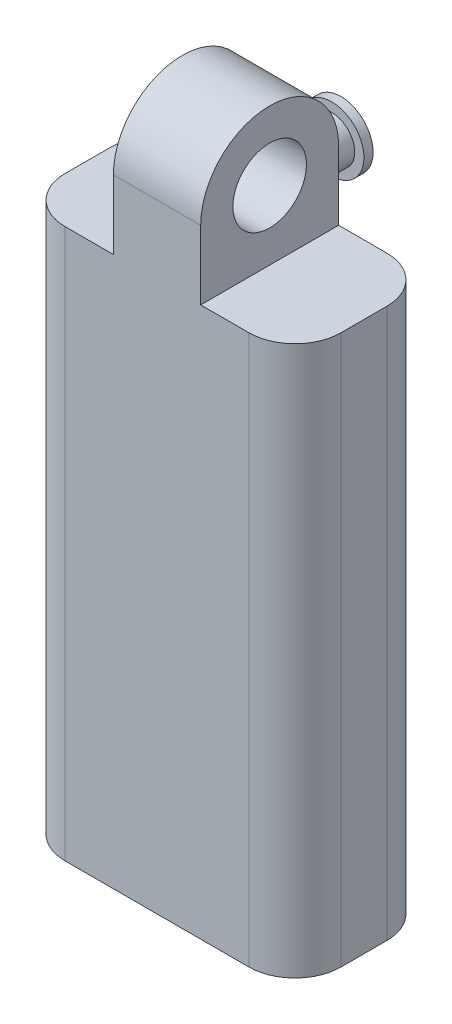
ISO-10303-21;
HEADER;
FILE_DESCRIPTION(('STEP AP214'),'2;1');
FILE_NAME('part.step','',(''),(''),'','','');
FILE_SCHEMA(('AUTOMOTIVE_DESIGN { 1 0 10303 214 1 1 1 1 }'));
ENDSEC;
DATA;
#1=APPLICATION_CONTEXT('core data for automotive mechanical design processes');
#2=APPLICATION_PROTOCOL_DEFINITION('international standard','automotive_design',2000,#1);
#3=PRODUCT_CONTEXT('',#1,'mechanical');
#4=PRODUCT('Part','Part','',(#3));
#5=PRODUCT_RELATED_PRODUCT_CATEGORY('part','',(#4));
#6=PRODUCT_DEFINITION_FORMATION('','',#4);
#7=PRODUCT_DEFINITION_CONTEXT('part definition',#1,'design');
#8=PRODUCT_DEFINITION('design','',#6,#7);
#9=PRODUCT_DEFINITION_SHAPE('','',#8);
#10=(LENGTH_UNIT() NAMED_UNIT(*) SI_UNIT(.MILLI.,.METRE.));
#11=(NAMED_UNIT(*) PLANE_ANGLE_UNIT() SI_UNIT($,.RADIAN.));
#12=(NAMED_UNIT(*) SI_UNIT($,.STERADIAN.) SOLID_ANGLE_UNIT());
#13=UNCERTAINTY_MEASURE_WITH_UNIT(LENGTH_MEASURE(1.E-05),#10,'distance_accuracy_value','');
#14=(GEOMETRIC_REPRESENTATION_CONTEXT(3) GLOBAL_UNCERTAINTY_ASSIGNED_CONTEXT((#13)) GLOBAL_UNIT_ASSIGNED_CONTEXT((#10,
#11,#12)) REPRESENTATION_CONTEXT('',''));
#15=CARTESIAN_POINT('',(0.,0.,0.));
#16=DIRECTION('',(0.,0.,1.));
#17=DIRECTION('',(1.,0.,0.));
#18=AXIS2_PLACEMENT_3D('',#15,#16,#17);
#19=CARTESIAN_POINT('',(2.375,37.37,3.75));
#20=DIRECTION('',(-1.,0.,0.));
#21=DIRECTION('',(0.,0.,1.));
#22=AXIS2_PLACEMENT_3D('',#19,#20,#21);
#23=PLANE('',#22);
#24=CARTESIAN_POINT('',(2.375,33.62,0.));
#25=DIRECTION('',(-1.,0.,0.));
#26=DIRECTION('',(0.,0.,1.));
#27=AXIS2_PLACEMENT_3D('',#24,#25,#26);
#28=CIRCLE('',#27,2.);
#29=CARTESIAN_POINT('',(2.375,33.62,2.));
#30=VERTEX_POINT('',#29);
#31=EDGE_CURVE('E253',#30,#30,#28,.T.);
#32=ORIENTED_EDGE('',*,*,#31,.T.);
#33=EDGE_LOOP('',(#32));
#34=FACE_BOUND('',#33,.T.);
#35=DIRECTION('',(0.,-1.,0.));
#36=VECTOR('',#35,1.);
#37=CARTESIAN_POINT('',(2.375,37.37,-3.75));
#38=LINE('',#37,#36);
#39=CARTESIAN_POINT('',(2.375,33.62,-3.75));
#40=VERTEX_POINT('',#39);
#41=CARTESIAN_POINT('',(2.375,29.87,-3.75));
#42=VERTEX_POINT('',#41);
#43=EDGE_CURVE('E103',#40,#42,#38,.T.);
#44=ORIENTED_EDGE('',*,*,#43,.F.);
#45=CARTESIAN_POINT('',(2.375,33.62,0.));
#46=DIRECTION('',(-1.,0.,0.));
#47=DIRECTION('',(0.,0.,1.));
#48=AXIS2_PLACEMENT_3D('',#45,#46,#47);
#49=CIRCLE('',#48,3.75);
#50=CARTESIAN_POINT('',(2.375,33.62,3.75));
#51=VERTEX_POINT('',#50);
#52=EDGE_CURVE('E172',#51,#40,#49,.T.);
#53=ORIENTED_EDGE('',*,*,#52,.F.);
#54=DIRECTION('',(0.,-1.,0.));
#55=VECTOR('',#54,1.);
#56=CARTESIAN_POINT('',(2.375,37.37,3.75));
#57=LINE('',#56,#55);
#58=CARTESIAN_POINT('',(2.375,29.87,3.75));
#59=VERTEX_POINT('',#58);
#60=EDGE_CURVE('E265',#51,#59,#57,.T.);
#61=ORIENTED_EDGE('',*,*,#60,.T.);
#62=DIRECTION('',(0.,0.,-1.));
#63=VECTOR('',#62,1.);
#64=CARTESIAN_POINT('',(2.375,29.87,3.75));
#65=LINE('',#64,#63);
#66=EDGE_CURVE('E186',#59,#42,#65,.T.);
#67=ORIENTED_EDGE('',*,*,#66,.T.);
#68=EDGE_LOOP('',(#44,#53,#61,#67));
#69=FACE_BOUND('',#68,.T.);
#70=ADVANCED_FACE('F80',(#34,#69),#23,.F.);
#71=CARTESIAN_POINT('',(-2.375,37.37,3.75));
#72=DIRECTION('',(1.,0.,0.));
#73=DIRECTION('',(0.,0.,-1.));
#74=AXIS2_PLACEMENT_3D('',#71,#72,#73);
#75=PLANE('',#74);
#76=CARTESIAN_POINT('',(-2.375,33.62,0.));
#77=DIRECTION('',(1.,0.,0.));
#78=DIRECTION('',(0.,0.,-1.));
#79=AXIS2_PLACEMENT_3D('',#76,#77,#78);
#80=CIRCLE('',#79,2.);
#81=CARTESIAN_POINT('',(-2.375,33.62,-2.00000000000001));
#82=VERTEX_POINT('',#81);
#83=EDGE_CURVE('E178',#82,#82,#80,.T.);
#84=ORIENTED_EDGE('',*,*,#83,.T.);
#85=EDGE_LOOP('',(#84));
#86=FACE_BOUND('',#85,.T.);
#87=CARTESIAN_POINT('',(-2.375,33.62,0.));
#88=DIRECTION('',(1.,0.,0.));
#89=DIRECTION('',(0.,0.,-1.));
#90=AXIS2_PLACEMENT_3D('',#87,#88,#89);
#91=CIRCLE('',#90,3.75);
#92=CARTESIAN_POINT('',(-2.375,33.62,-3.75));
#93=VERTEX_POINT('',#92);
#94=CARTESIAN_POINT('',(-2.375,33.62,3.75));
#95=VERTEX_POINT('',#94);
#96=EDGE_CURVE('E179',#93,#95,#91,.T.);
#97=ORIENTED_EDGE('',*,*,#96,.F.);
#98=DIRECTION('',(0.,-1.,0.));
#99=VECTOR('',#98,1.);
#100=CARTESIAN_POINT('',(-2.375,37.37,-3.75));
#101=LINE('',#100,#99);
#102=CARTESIAN_POINT('',(-2.375,29.87,-3.75));
#103=VERTEX_POINT('',#102);
#104=EDGE_CURVE('E95',#93,#103,#101,.T.);
#105=ORIENTED_EDGE('',*,*,#104,.T.);
#106=DIRECTION('',(0.,0.,1.));
#107=VECTOR('',#106,1.);
#108=CARTESIAN_POINT('',(-2.375,29.87,3.75));
#109=LINE('',#108,#107);
#110=CARTESIAN_POINT('',(-2.375,29.87,3.75));
#111=VERTEX_POINT('',#110);
#112=EDGE_CURVE('E260',#103,#111,#109,.T.);
#113=ORIENTED_EDGE('',*,*,#112,.T.);
#114=DIRECTION('',(0.,-1.,0.));
#115=VECTOR('',#114,1.);
#116=CARTESIAN_POINT('',(-2.375,37.37,3.75));
#117=LINE('',#116,#115);
#118=EDGE_CURVE('E192',#95,#111,#117,.T.);
#119=ORIENTED_EDGE('',*,*,#118,.F.);
#120=EDGE_LOOP('',(#97,#105,#113,#119));
#121=FACE_BOUND('',#120,.T.);
#122=ADVANCED_FACE('F273',(#86,#121),#75,.F.);
#123=CARTESIAN_POINT('',(-4.99999999999998,29.87,-3.75));
#124=DIRECTION('',(0.,0.,1.));
#125=DIRECTION('',(1.,0.,0.));
#126=AXIS2_PLACEMENT_3D('',#123,#124,#125);
#127=PLANE('',#126);
#128=CARTESIAN_POINT('',(0.,31.745,-3.75));
#129=DIRECTION('',(0.,0.,1.));
#130=DIRECTION('',(1.,0.,0.));
#131=AXIS2_PLACEMENT_3D('',#128,#129,#130);
#132=CIRCLE('',#131,1.25);
#133=CARTESIAN_POINT('',(1.25,31.745,-3.75));
#134=VERTEX_POINT('',#133);
#135=EDGE_CURVE('E12',#134,#134,#132,.F.);
#136=ORIENTED_EDGE('',*,*,#135,.F.);
#137=EDGE_LOOP('',(#136));
#138=FACE_BOUND('',#137,.T.);
#139=DIRECTION('',(-1.,0.,0.));
#140=VECTOR('',#139,1.);
#141=CARTESIAN_POINT('',(7.5,33.62,-3.75));
#142=LINE('',#141,#140);
#143=EDGE_CURVE('E88',#40,#93,#142,.T.);
#144=ORIENTED_EDGE('',*,*,#143,.F.);
#145=ORIENTED_EDGE('',*,*,#43,.T.);
#146=DIRECTION('',(-1.,0.,0.));
#147=VECTOR('',#146,1.);
#148=CARTESIAN_POINT('',(-4.99999999999998,29.87,-3.75));
#149=LINE('',#148,#147);
#150=CARTESIAN_POINT('',(4.99999999999998,29.87,-3.75));
#151=VERTEX_POINT('',#150);
#152=EDGE_CURVE('E211',#151,#42,#149,.T.);
#153=ORIENTED_EDGE('',*,*,#152,.F.);
#154=DIRECTION('',(0.,-1.,0.));
#155=VECTOR('',#154,1.);
#156=CARTESIAN_POINT('',(4.99999999999998,29.87,-3.75));
#157=LINE('',#156,#155);
#158=CARTESIAN_POINT('',(4.99999999999998,0.,-3.75));
#159=VERTEX_POINT('',#158);
#160=EDGE_CURVE('E238',#151,#159,#157,.T.);
#161=ORIENTED_EDGE('',*,*,#160,.T.);
#162=DIRECTION('',(-1.,0.,0.));
#163=VECTOR('',#162,1.);
#164=CARTESIAN_POINT('',(-4.99999999999998,0.,-3.75));
#165=LINE('',#164,#163);
#166=CARTESIAN_POINT('',(-4.99999999999998,0.,-3.75));
#167=VERTEX_POINT('',#166);
#168=EDGE_CURVE('E225',#159,#167,#165,.T.);
#169=ORIENTED_EDGE('',*,*,#168,.T.);
#170=DIRECTION('',(0.,-1.,0.));
#171=VECTOR('',#170,1.);
#172=CARTESIAN_POINT('',(-4.99999999999998,29.87,-3.75));
#173=LINE('',#172,#171);
#174=CARTESIAN_POINT('',(-4.99999999999998,29.87,-3.75));
#175=VERTEX_POINT('',#174);
#176=EDGE_CURVE('E235',#175,#167,#173,.T.);
#177=ORIENTED_EDGE('',*,*,#176,.F.);
#178=EDGE_CURVE('E210',#103,#175,#149,.T.);
#179=ORIENTED_EDGE('',*,*,#178,.F.);
#180=ORIENTED_EDGE('',*,*,#104,.F.);
#181=EDGE_LOOP('',(#144,#145,#153,#161,#169,#177,#179,#180));
#182=FACE_BOUND('',#181,.T.);
#183=ADVANCED_FACE('F181',(#138,#182),#127,.F.);
#184=CARTESIAN_POINT('',(-5.,29.87,1.25));
#185=DIRECTION('',(0.,1.,0.));
#186=DIRECTION('',(0.,0.,1.));
#187=AXIS2_PLACEMENT_3D('',#184,#185,#186);
#188=PLANE('',#187);
#189=ORIENTED_EDGE('',*,*,#66,.F.);
#190=DIRECTION('',(1.,0.,0.));
#191=VECTOR('',#190,1.);
#192=CARTESIAN_POINT('',(-4.99999999999998,29.87,3.75));
#193=LINE('',#192,#191);
#194=CARTESIAN_POINT('',(4.99999999999998,29.87,3.75));
#195=VERTEX_POINT('',#194);
#196=EDGE_CURVE('E199',#59,#195,#193,.T.);
#197=ORIENTED_EDGE('',*,*,#196,.T.);
#198=CARTESIAN_POINT('',(5.,29.87,1.25));
#199=DIRECTION('',(0.,1.,0.));
#200=DIRECTION('',(0.,0.,1.));
#201=AXIS2_PLACEMENT_3D('',#198,#199,#200);
#202=CIRCLE('',#201,2.5);
#203=CARTESIAN_POINT('',(7.5,29.87,1.24999999999998));
#204=VERTEX_POINT('',#203);
#205=EDGE_CURVE('E204',#195,#204,#202,.T.);
#206=ORIENTED_EDGE('',*,*,#205,.T.);
#207=DIRECTION('',(0.,0.,-1.));
#208=VECTOR('',#207,1.);
#209=CARTESIAN_POINT('',(7.5,29.87,-1.24999999999998));
#210=LINE('',#209,#208);
#211=CARTESIAN_POINT('',(7.5,29.87,-1.24999999999998));
#212=VERTEX_POINT('',#211);
#213=EDGE_CURVE('E206',#204,#212,#210,.T.);
#214=ORIENTED_EDGE('',*,*,#213,.T.);
#215=CARTESIAN_POINT('',(5.,29.87,-1.25));
#216=DIRECTION('',(0.,1.,0.));
#217=DIRECTION('',(0.,0.,-1.));
#218=AXIS2_PLACEMENT_3D('',#215,#216,#217);
#219=CIRCLE('',#218,2.5);
#220=EDGE_CURVE('E208',#212,#151,#219,.T.);
#221=ORIENTED_EDGE('',*,*,#220,.T.);
#222=ORIENTED_EDGE('',*,*,#152,.T.);
#223=EDGE_LOOP('',(#189,#197,#206,#214,#221,#222));
#224=FACE_BOUND('',#223,.T.);
#225=ADVANCED_FACE('F280',(#224),#188,.T.);
#226=CARTESIAN_POINT('',(-5.,29.87,1.25));
#227=DIRECTION('',(0.,-1.,0.));
#228=DIRECTION('',(0.,0.,-1.));
#229=AXIS2_PLACEMENT_3D('',#226,#227,#228);
#230=CYLINDRICAL_SURFACE('',#229,2.5);
#231=CARTESIAN_POINT('',(-5.,0.,1.25));
#232=DIRECTION('',(0.,1.,0.));
#233=DIRECTION('',(0.,0.,1.));
#234=AXIS2_PLACEMENT_3D('',#231,#232,#233);
#235=CIRCLE('',#234,2.5);
#236=CARTESIAN_POINT('',(-7.5,0.,1.24999999999998));
#237=VERTEX_POINT('',#236);
#238=CARTESIAN_POINT('',(-4.99999999999998,0.,3.75));
#239=VERTEX_POINT('',#238);
#240=EDGE_CURVE('E187',#237,#239,#235,.T.);
#241=ORIENTED_EDGE('',*,*,#240,.T.);
#242=DIRECTION('',(0.,-1.,0.));
#243=VECTOR('',#242,1.);
#244=CARTESIAN_POINT('',(-4.99999999999998,29.87,3.75));
#245=LINE('',#244,#243);
#246=CARTESIAN_POINT('',(-4.99999999999998,29.87,3.75));
#247=VERTEX_POINT('',#246);
#248=EDGE_CURVE('E183',#247,#239,#245,.T.);
#249=ORIENTED_EDGE('',*,*,#248,.F.);
#250=CARTESIAN_POINT('',(-5.,29.87,1.25));
#251=DIRECTION('',(0.,1.,0.));
#252=DIRECTION('',(0.,0.,1.));
#253=AXIS2_PLACEMENT_3D('',#250,#251,#252);
#254=CIRCLE('',#253,2.5);
#255=CARTESIAN_POINT('',(-7.5,29.87,1.24999999999998));
#256=VERTEX_POINT('',#255);
#257=EDGE_CURVE('E196',#256,#247,#254,.T.);
#258=ORIENTED_EDGE('',*,*,#257,.F.);
#259=DIRECTION('',(0.,-1.,0.));
#260=VECTOR('',#259,1.);
#261=CARTESIAN_POINT('',(-7.5,29.87,1.24999999999998));
#262=LINE('',#261,#260);
#263=EDGE_CURVE('E216',#256,#237,#262,.T.);
#264=ORIENTED_EDGE('',*,*,#263,.T.);
#265=EDGE_LOOP('',(#241,#249,#258,#264));
#266=FACE_BOUND('',#265,.T.);
#267=ADVANCED_FACE('F82',(#266),#230,.T.);
#268=CARTESIAN_POINT('',(-4.99999999999998,29.87,3.75));
#269=DIRECTION('',(0.,0.,-1.));
#270=DIRECTION('',(-1.,0.,0.));
#271=AXIS2_PLACEMENT_3D('',#268,#269,#270);
#272=PLANE('',#271);
#273=ORIENTED_EDGE('',*,*,#60,.F.);
#274=DIRECTION('',(-1.,0.,0.));
#275=VECTOR('',#274,1.);
#276=CARTESIAN_POINT('',(7.5,33.62,3.75));
#277=LINE('',#276,#275);
#278=EDGE_CURVE('E175',#51,#95,#277,.T.);
#279=ORIENTED_EDGE('',*,*,#278,.T.);
#280=ORIENTED_EDGE('',*,*,#118,.T.);
#281=EDGE_CURVE('E201',#247,#111,#193,.T.);
#282=ORIENTED_EDGE('',*,*,#281,.F.);
#283=ORIENTED_EDGE('',*,*,#248,.T.);
#284=DIRECTION('',(1.,0.,0.));
#285=VECTOR('',#284,1.);
#286=CARTESIAN_POINT('',(-4.99999999999998,0.,3.75));
#287=LINE('',#286,#285);
#288=CARTESIAN_POINT('',(4.99999999999998,0.,3.75));
#289=VERTEX_POINT('',#288);
#290=EDGE_CURVE('E190',#239,#289,#287,.T.);
#291=ORIENTED_EDGE('',*,*,#290,.T.);
#292=DIRECTION('',(0.,-1.,0.));
#293=VECTOR('',#292,1.);
#294=CARTESIAN_POINT('',(4.99999999999998,29.87,3.75));
#295=LINE('',#294,#293);
#296=EDGE_CURVE('E247',#195,#289,#295,.T.);
#297=ORIENTED_EDGE('',*,*,#296,.F.);
#298=ORIENTED_EDGE('',*,*,#196,.F.);
#299=EDGE_LOOP('',(#273,#279,#280,#282,#283,#291,#297,#298));
#300=FACE_BOUND('',#299,.T.);
#301=ADVANCED_FACE('F268',(#300),#272,.F.);
#302=CARTESIAN_POINT('',(5.,29.87,1.25));
#303=DIRECTION('',(0.,-1.,0.));
#304=DIRECTION('',(0.,0.,-1.));
#305=AXIS2_PLACEMENT_3D('',#302,#303,#304);
#306=CYLINDRICAL_SURFACE('',#305,2.5);
#307=CARTESIAN_POINT('',(5.,0.,1.25));
#308=DIRECTION('',(0.,1.,0.));
#309=DIRECTION('',(0.,0.,1.));
#310=AXIS2_PLACEMENT_3D('',#307,#308,#309);
#311=CIRCLE('',#310,2.5);
#312=CARTESIAN_POINT('',(7.5,0.,1.24999999999998));
#313=VERTEX_POINT('',#312);
#314=EDGE_CURVE('E219',#289,#313,#311,.T.);
#315=ORIENTED_EDGE('',*,*,#314,.T.);
#316=DIRECTION('',(0.,-1.,0.));
#317=VECTOR('',#316,1.);
#318=CARTESIAN_POINT('',(7.5,29.87,1.24999999999998));
#319=LINE('',#318,#317);
#320=EDGE_CURVE('E244',#204,#313,#319,.T.);
#321=ORIENTED_EDGE('',*,*,#320,.F.);
#322=ORIENTED_EDGE('',*,*,#205,.F.);
#323=ORIENTED_EDGE('',*,*,#296,.T.);
#324=EDGE_LOOP('',(#315,#321,#322,#323));
#325=FACE_BOUND('',#324,.T.);
#326=ADVANCED_FACE('F309',(#325),#306,.T.);
#327=CARTESIAN_POINT('',(7.5,29.87,-1.24999999999998));
#328=DIRECTION('',(-1.,0.,0.));
#329=DIRECTION('',(0.,0.,1.));
#330=AXIS2_PLACEMENT_3D('',#327,#328,#329);
#331=PLANE('',#330);
#332=DIRECTION('',(0.,0.,-1.));
#333=VECTOR('',#332,1.);
#334=CARTESIAN_POINT('',(7.5,0.,-1.24999999999998));
#335=LINE('',#334,#333);
#336=CARTESIAN_POINT('',(7.5,0.,-1.24999999999998));
#337=VERTEX_POINT('',#336);
#338=EDGE_CURVE('E221',#313,#337,#335,.T.);
#339=ORIENTED_EDGE('',*,*,#338,.T.);
#340=DIRECTION('',(0.,-1.,0.));
#341=VECTOR('',#340,1.);
#342=CARTESIAN_POINT('',(7.5,29.87,-1.24999999999998));
#343=LINE('',#342,#341);
#344=EDGE_CURVE('E241',#212,#337,#343,.T.);
#345=ORIENTED_EDGE('',*,*,#344,.F.);
#346=ORIENTED_EDGE('',*,*,#213,.F.);
#347=ORIENTED_EDGE('',*,*,#320,.T.);
#348=EDGE_LOOP('',(#339,#345,#346,#347));
#349=FACE_BOUND('',#348,.T.);
#350=ADVANCED_FACE('F305',(#349),#331,.F.);
#351=CARTESIAN_POINT('',(5.,29.87,-1.25));
#352=DIRECTION('',(0.,-1.,0.));
#353=DIRECTION('',(0.,0.,-1.));
#354=AXIS2_PLACEMENT_3D('',#351,#352,#353);
#355=CYLINDRICAL_SURFACE('',#354,2.5);
#356=CARTESIAN_POINT('',(5.,0.,-1.25));
#357=DIRECTION('',(0.,1.,0.));
#358=DIRECTION('',(0.,0.,-1.));
#359=AXIS2_PLACEMENT_3D('',#356,#357,#358);
#360=CIRCLE('',#359,2.5);
#361=EDGE_CURVE('E223',#337,#159,#360,.T.);
#362=ORIENTED_EDGE('',*,*,#361,.T.);
#363=ORIENTED_EDGE('',*,*,#160,.F.);
#364=ORIENTED_EDGE('',*,*,#220,.F.);
#365=ORIENTED_EDGE('',*,*,#344,.T.);
#366=EDGE_LOOP('',(#362,#363,#364,#365));
#367=FACE_BOUND('',#366,.T.);
#368=ADVANCED_FACE('F300',(#367),#355,.T.);
#369=CARTESIAN_POINT('',(-5.,29.87,-1.25));
#370=DIRECTION('',(0.,-1.,0.));
#371=DIRECTION('',(0.,0.,-1.));
#372=AXIS2_PLACEMENT_3D('',#369,#370,#371);
#373=CYLINDRICAL_SURFACE('',#372,2.5);
#374=CARTESIAN_POINT('',(-5.,0.,-1.25));
#375=DIRECTION('',(0.,1.,0.));
#376=DIRECTION('',(0.,0.,1.));
#377=AXIS2_PLACEMENT_3D('',#374,#375,#376);
#378=CIRCLE('',#377,2.5);
#379=CARTESIAN_POINT('',(-7.5,0.,-1.24999999999998));
#380=VERTEX_POINT('',#379);
#381=EDGE_CURVE('E227',#167,#380,#378,.T.);
#382=ORIENTED_EDGE('',*,*,#381,.T.);
#383=DIRECTION('',(0.,-1.,0.));
#384=VECTOR('',#383,1.);
#385=CARTESIAN_POINT('',(-7.5,29.87,-1.24999999999998));
#386=LINE('',#385,#384);
#387=CARTESIAN_POINT('',(-7.5,29.87,-1.24999999999998));
#388=VERTEX_POINT('',#387);
#389=EDGE_CURVE('E232',#388,#380,#386,.T.);
#390=ORIENTED_EDGE('',*,*,#389,.F.);
#391=CARTESIAN_POINT('',(-5.,29.87,-1.25));
#392=DIRECTION('',(0.,1.,0.));
#393=DIRECTION('',(0.,0.,1.));
#394=AXIS2_PLACEMENT_3D('',#391,#392,#393);
#395=CIRCLE('',#394,2.5);
#396=EDGE_CURVE('E213',#175,#388,#395,.T.);
#397=ORIENTED_EDGE('',*,*,#396,.F.);
#398=ORIENTED_EDGE('',*,*,#176,.T.);
#399=EDGE_LOOP('',(#382,#390,#397,#398));
#400=FACE_BOUND('',#399,.T.);
#401=ADVANCED_FACE('F297',(#400),#373,.T.);
#402=CARTESIAN_POINT('',(-7.5,29.87,-1.24999999999998));
#403=DIRECTION('',(1.,0.,0.));
#404=DIRECTION('',(0.,0.,-1.));
#405=AXIS2_PLACEMENT_3D('',#402,#403,#404);
#406=PLANE('',#405);
#407=DIRECTION('',(0.,0.,1.));
#408=VECTOR('',#407,1.);
#409=CARTESIAN_POINT('',(-7.5,0.,-1.24999999999998));
#410=LINE('',#409,#408);
#411=EDGE_CURVE('E200',#380,#237,#410,.T.);
#412=ORIENTED_EDGE('',*,*,#411,.T.);
#413=ORIENTED_EDGE('',*,*,#263,.F.);
#414=DIRECTION('',(0.,0.,1.));
#415=VECTOR('',#414,1.);
#416=CARTESIAN_POINT('',(-7.5,29.87,-1.24999999999998));
#417=LINE('',#416,#415);
#418=EDGE_CURVE('E215',#388,#256,#417,.T.);
#419=ORIENTED_EDGE('',*,*,#418,.F.);
#420=ORIENTED_EDGE('',*,*,#389,.T.);
#421=EDGE_LOOP('',(#412,#413,#419,#420));
#422=FACE_BOUND('',#421,.T.);
#423=ADVANCED_FACE('F291',(#422),#406,.F.);
#424=ORIENTED_EDGE('',*,*,#112,.F.);
#425=ORIENTED_EDGE('',*,*,#178,.T.);
#426=ORIENTED_EDGE('',*,*,#396,.T.);
#427=ORIENTED_EDGE('',*,*,#418,.T.);
#428=ORIENTED_EDGE('',*,*,#257,.T.);
#429=ORIENTED_EDGE('',*,*,#281,.T.);
#430=EDGE_LOOP('',(#424,#425,#426,#427,#428,#429));
#431=FACE_BOUND('',#430,.T.);
#432=ADVANCED_FACE('F270',(#431),#188,.T.);
#433=CARTESIAN_POINT('',(-5.,0.,1.25));
#434=DIRECTION('',(0.,1.,0.));
#435=DIRECTION('',(0.,0.,1.));
#436=AXIS2_PLACEMENT_3D('',#433,#434,#435);
#437=PLANE('',#436);
#438=ORIENTED_EDGE('',*,*,#240,.F.);
#439=ORIENTED_EDGE('',*,*,#411,.F.);
#440=ORIENTED_EDGE('',*,*,#381,.F.);
#441=ORIENTED_EDGE('',*,*,#168,.F.);
#442=ORIENTED_EDGE('',*,*,#361,.F.);
#443=ORIENTED_EDGE('',*,*,#338,.F.);
#444=ORIENTED_EDGE('',*,*,#314,.F.);
#445=ORIENTED_EDGE('',*,*,#290,.F.);
#446=EDGE_LOOP('',(#438,#439,#440,#441,#442,#443,#444,#445));
#447=FACE_BOUND('',#446,.T.);
#448=ADVANCED_FACE('F290',(#447),#437,.F.);
#449=CARTESIAN_POINT('',(7.5,33.62,0.));
#450=DIRECTION('',(-1.,0.,0.));
#451=DIRECTION('',(0.,0.,1.));
#452=AXIS2_PLACEMENT_3D('',#449,#450,#451);
#453=CYLINDRICAL_SURFACE('',#452,3.75);
#454=ORIENTED_EDGE('',*,*,#52,.T.);
#455=ORIENTED_EDGE('',*,*,#143,.T.);
#456=ORIENTED_EDGE('',*,*,#96,.T.);
#457=ORIENTED_EDGE('',*,*,#278,.F.);
#458=EDGE_LOOP('',(#454,#455,#456,#457));
#459=FACE_BOUND('',#458,.T.);
#460=ADVANCED_FACE('F173',(#459),#453,.T.);
#461=CARTESIAN_POINT('',(7.5,33.62,0.));
#462=DIRECTION('',(-1.,0.,0.));
#463=DIRECTION('',(0.,0.,1.));
#464=AXIS2_PLACEMENT_3D('',#461,#462,#463);
#465=CYLINDRICAL_SURFACE('',#464,2.);
#466=ORIENTED_EDGE('',*,*,#83,.F.);
#467=EDGE_LOOP('',(#466));
#468=FACE_BOUND('',#467,.T.);
#469=ORIENTED_EDGE('',*,*,#31,.F.);
#470=EDGE_LOOP('',(#469));
#471=FACE_BOUND('',#470,.T.);
#472=ADVANCED_FACE('F285',(#468,#471),#465,.F.);
#473=CARTESIAN_POINT('',(0.,31.745,-5.75));
#474=DIRECTION('',(0.,0.,1.));
#475=DIRECTION('',(1.,0.,0.));
#476=AXIS2_PLACEMENT_3D('',#473,#474,#475);
#477=CYLINDRICAL_SURFACE('',#476,1.25);
#478=CARTESIAN_POINT('',(0.,31.745,-5.75));
#479=DIRECTION('',(0.,0.,-1.));
#480=DIRECTION('',(-1.,0.,0.));
#481=AXIS2_PLACEMENT_3D('',#478,#479,#480);
#482=CIRCLE('',#481,1.25);
#483=CARTESIAN_POINT('',(-1.25000000000001,31.745,-5.75));
#484=VERTEX_POINT('',#483);
#485=EDGE_CURVE('E482',#484,#484,#482,.T.);
#486=ORIENTED_EDGE('',*,*,#485,.F.);
#487=EDGE_LOOP('',(#486));
#488=FACE_BOUND('',#487,.T.);
#489=ORIENTED_EDGE('',*,*,#135,.T.);
#490=EDGE_LOOP('',(#489));
#491=FACE_BOUND('',#490,.T.);
#492=ADVANCED_FACE('F362',(#488,#491),#477,.T.);
#493=CARTESIAN_POINT('',(0.,31.745,-6.25));
#494=DIRECTION('',(0.,0.,1.));
#495=DIRECTION('',(1.,0.,0.));
#496=AXIS2_PLACEMENT_3D('',#493,#494,#495);
#497=CYLINDRICAL_SURFACE('',#496,1.75);
#498=CARTESIAN_POINT('',(0.,31.745,-6.25));
#499=DIRECTION('',(0.,0.,-1.));
#500=DIRECTION('',(-1.,0.,0.));
#501=AXIS2_PLACEMENT_3D('',#498,#499,#500);
#502=CIRCLE('',#501,1.75);
#503=CARTESIAN_POINT('',(-1.75000000000001,31.745,-6.25));
#504=VERTEX_POINT('',#503);
#505=EDGE_CURVE('E487',#504,#504,#502,.T.);
#506=ORIENTED_EDGE('',*,*,#505,.F.);
#507=EDGE_LOOP('',(#506));
#508=FACE_BOUND('',#507,.T.);
#509=CARTESIAN_POINT('',(0.,31.745,-5.75));
#510=DIRECTION('',(0.,0.,-1.));
#511=DIRECTION('',(-1.,0.,0.));
#512=AXIS2_PLACEMENT_3D('',#509,#510,#511);
#513=CIRCLE('',#512,1.75);
#514=CARTESIAN_POINT('',(-1.75000000000001,31.745,-5.75));
#515=VERTEX_POINT('',#514);
#516=EDGE_CURVE('E485',#515,#515,#513,.T.);
#517=ORIENTED_EDGE('',*,*,#516,.T.);
#518=EDGE_LOOP('',(#517));
#519=FACE_BOUND('',#518,.T.);
#520=ADVANCED_FACE('F367',(#508,#519),#497,.T.);
#521=CARTESIAN_POINT('',(0.,31.745,-6.25));
#522=DIRECTION('',(0.,0.,-1.));
#523=DIRECTION('',(-1.,0.,0.));
#524=AXIS2_PLACEMENT_3D('',#521,#522,#523);
#525=PLANE('',#524);
#526=ORIENTED_EDGE('',*,*,#505,.T.);
#527=EDGE_LOOP('',(#526));
#528=FACE_BOUND('',#527,.T.);
#529=ADVANCED_FACE('F377',(#528),#525,.T.);
#530=CARTESIAN_POINT('',(0.,31.745,-5.75));
#531=DIRECTION('',(0.,0.,-1.));
#532=DIRECTION('',(-1.,0.,0.));
#533=AXIS2_PLACEMENT_3D('',#530,#531,#532);
#534=PLANE('',#533);
#535=ORIENTED_EDGE('',*,*,#485,.T.);
#536=EDGE_LOOP('',(#535));
#537=FACE_BOUND('',#536,.T.);
#538=ORIENTED_EDGE('',*,*,#516,.F.);
#539=EDGE_LOOP('',(#538));
#540=FACE_BOUND('',#539,.T.);
#541=ADVANCED_FACE('F387',(#537,#540),#534,.F.);
#542=CLOSED_SHELL('',(#70,#122,#183,#225,#267,#301,#326,#350,#368,#401,#423,#432,#448,#460,#472,
#492,#520,#529,#541));
#543=MANIFOLD_SOLID_BREP('B2',#542);
#544=ADVANCED_BREP_SHAPE_REPRESENTATION('',(#18,#543),#14);
#545=SHAPE_DEFINITION_REPRESENTATION(#9,#544);
ENDSEC;
END-ISO-10303-21;
